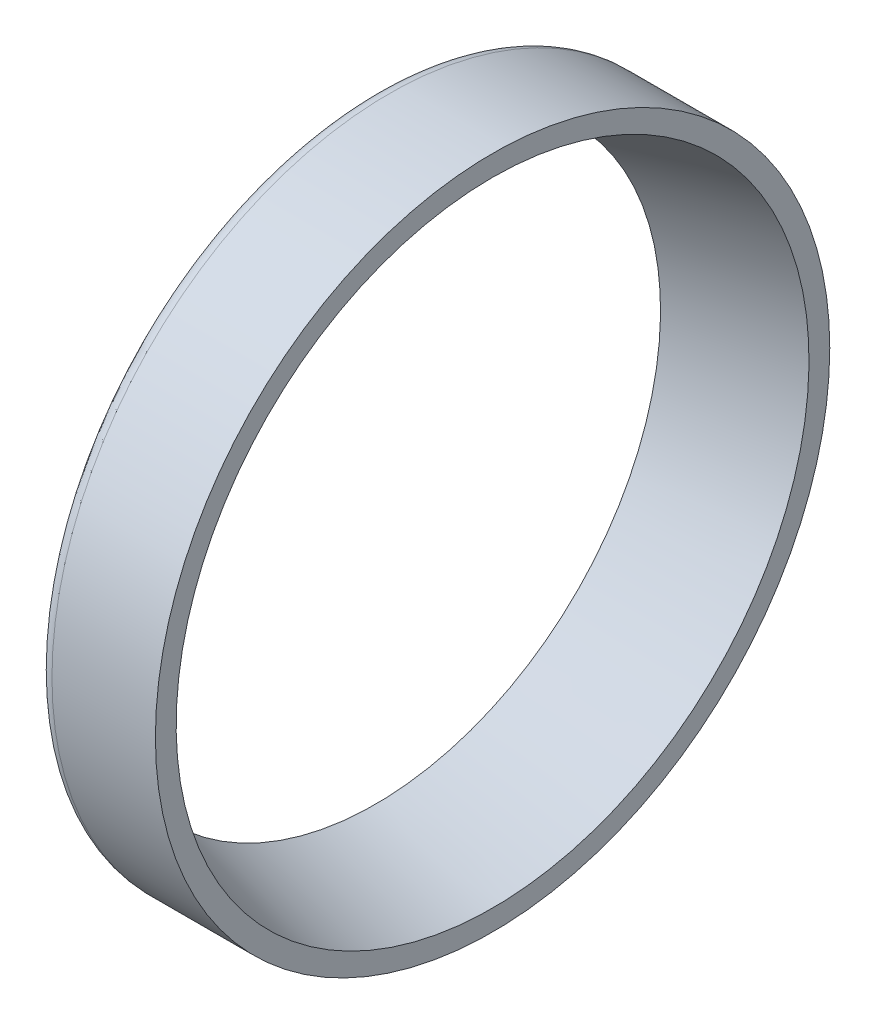
ISO-10303-21;
HEADER;
FILE_DESCRIPTION(('STEP AP214'),'2;1');
FILE_NAME('part.step','',(''),(''),'','','');
FILE_SCHEMA(('AUTOMOTIVE_DESIGN { 1 0 10303 214 1 1 1 1 }'));
ENDSEC;
DATA;
#1=APPLICATION_CONTEXT('core data for automotive mechanical design processes');
#2=APPLICATION_PROTOCOL_DEFINITION('international standard','automotive_design',2000,#1);
#3=PRODUCT_CONTEXT('',#1,'mechanical');
#4=PRODUCT('Part','Part','',(#3));
#5=PRODUCT_RELATED_PRODUCT_CATEGORY('part','',(#4));
#6=PRODUCT_DEFINITION_FORMATION('','',#4);
#7=PRODUCT_DEFINITION_CONTEXT('part definition',#1,'design');
#8=PRODUCT_DEFINITION('design','',#6,#7);
#9=PRODUCT_DEFINITION_SHAPE('','',#8);
#10=(LENGTH_UNIT() NAMED_UNIT(*) SI_UNIT(.MILLI.,.METRE.));
#11=(NAMED_UNIT(*) PLANE_ANGLE_UNIT() SI_UNIT($,.RADIAN.));
#12=(NAMED_UNIT(*) SI_UNIT($,.STERADIAN.) SOLID_ANGLE_UNIT());
#13=UNCERTAINTY_MEASURE_WITH_UNIT(LENGTH_MEASURE(1.E-05),#10,'distance_accuracy_value','');
#14=(GEOMETRIC_REPRESENTATION_CONTEXT(3) GLOBAL_UNCERTAINTY_ASSIGNED_CONTEXT((#13)) GLOBAL_UNIT_ASSIGNED_CONTEXT((#10,
#11,#12)) REPRESENTATION_CONTEXT('',''));
#15=CARTESIAN_POINT('',(0.,0.,0.));
#16=DIRECTION('',(0.,0.,1.));
#17=DIRECTION('',(1.,0.,0.));
#18=AXIS2_PLACEMENT_3D('',#15,#16,#17);
#19=CARTESIAN_POINT('',(50.,0.,0.));
#20=DIRECTION('',(-1.,0.,0.));
#21=DIRECTION('',(0.,0.,1.));
#22=AXIS2_PLACEMENT_3D('',#19,#20,#21);
#23=CYLINDRICAL_SURFACE('',#22,36.5125);
#24=CARTESIAN_POINT('',(12.7,0.,0.));
#25=DIRECTION('',(-1.,0.,0.));
#26=DIRECTION('',(0.,0.,1.));
#27=AXIS2_PLACEMENT_3D('',#24,#25,#26);
#28=CIRCLE('',#27,36.5125);
#29=CARTESIAN_POINT('',(12.7,0.,36.5125));
#30=VERTEX_POINT('',#29);
#31=EDGE_CURVE('E17',#30,#30,#28,.F.);
#32=ORIENTED_EDGE('',*,*,#31,.F.);
#33=EDGE_LOOP('',(#32));
#34=FACE_BOUND('',#33,.T.);
#35=CARTESIAN_POINT('',(1.5,0.,0.));
#36=DIRECTION('',(1.,0.,0.));
#37=DIRECTION('',(0.,0.,-1.));
#38=AXIS2_PLACEMENT_3D('',#35,#36,#37);
#39=CIRCLE('',#38,36.5125);
#40=CARTESIAN_POINT('',(1.5,0.,-36.5125));
#41=VERTEX_POINT('',#40);
#42=EDGE_CURVE('E52',#41,#41,#39,.F.);
#43=ORIENTED_EDGE('',*,*,#42,.F.);
#44=EDGE_LOOP('',(#43));
#45=FACE_BOUND('',#44,.T.);
#46=ADVANCED_FACE('F14',(#34,#45),#23,.T.);
#47=CARTESIAN_POINT('',(1.5,0.,0.));
#48=DIRECTION('',(1.,0.,0.));
#49=DIRECTION('',(0.,0.,-1.));
#50=AXIS2_PLACEMENT_3D('',#47,#48,#49);
#51=TOROIDAL_SURFACE('',#50,35.0125,1.50000000000001);
#52=ORIENTED_EDGE('',*,*,#42,.T.);
#53=EDGE_LOOP('',(#52));
#54=FACE_BOUND('',#53,.T.);
#55=CARTESIAN_POINT('',(0.,0.,0.));
#56=DIRECTION('',(1.,0.,0.));
#57=DIRECTION('',(0.,0.,-1.));
#58=AXIS2_PLACEMENT_3D('',#55,#56,#57);
#59=CIRCLE('',#58,35.0125000223517);
#60=CARTESIAN_POINT('',(0.,0.,-35.0125000223517));
#61=VERTEX_POINT('',#60);
#62=EDGE_CURVE('E26',#61,#61,#59,.F.);
#63=ORIENTED_EDGE('',*,*,#62,.F.);
#64=EDGE_LOOP('',(#63));
#65=FACE_BOUND('',#64,.T.);
#66=ADVANCED_FACE('F33',(#54,#65),#51,.T.);
#67=CARTESIAN_POINT('',(12.7,34.2645100222922,0.));
#68=DIRECTION('',(1.,0.,0.));
#69=DIRECTION('',(0.,0.,-1.));
#70=AXIS2_PLACEMENT_3D('',#67,#68,#69);
#71=PLANE('',#70);
#72=CARTESIAN_POINT('',(12.7,0.,0.));
#73=DIRECTION('',(1.,0.,0.));
#74=DIRECTION('',(0.,1.,0.));
#75=AXIS2_PLACEMENT_3D('',#72,#73,#74);
#76=CIRCLE('',#75,34.2645100222922);
#77=CARTESIAN_POINT('',(12.7,34.2645100222922,0.));
#78=VERTEX_POINT('',#77);
#79=EDGE_CURVE('E21',#78,#78,#76,.F.);
#80=ORIENTED_EDGE('',*,*,#79,.T.);
#81=EDGE_LOOP('',(#80));
#82=FACE_BOUND('',#81,.T.);
#83=ORIENTED_EDGE('',*,*,#31,.T.);
#84=EDGE_LOOP('',(#83));
#85=FACE_BOUND('',#84,.T.);
#86=ADVANCED_FACE('F43',(#82,#85),#71,.T.);
#87=CARTESIAN_POINT('',(0.,35.0125,0.));
#88=DIRECTION('',(-1.,0.,0.));
#89=DIRECTION('',(0.,0.,1.));
#90=AXIS2_PLACEMENT_3D('',#87,#88,#89);
#91=PLANE('',#90);
#92=ORIENTED_EDGE('',*,*,#62,.T.);
#93=EDGE_LOOP('',(#92));
#94=FACE_BOUND('',#93,.T.);
#95=CARTESIAN_POINT('',(0.,0.,0.));
#96=DIRECTION('',(1.,0.,0.));
#97=DIRECTION('',(0.,1.,0.));
#98=AXIS2_PLACEMENT_3D('',#95,#96,#97);
#99=CIRCLE('',#98,30.8880608468145);
#100=CARTESIAN_POINT('',(0.,30.8880608468145,0.));
#101=VERTEX_POINT('',#100);
#102=EDGE_CURVE('E10',#101,#101,#99,.T.);
#103=ORIENTED_EDGE('',*,*,#102,.T.);
#104=EDGE_LOOP('',(#103));
#105=FACE_BOUND('',#104,.T.);
#106=ADVANCED_FACE('F61',(#94,#105),#91,.T.);
#107=CARTESIAN_POINT('',(12.7,0.,0.));
#108=DIRECTION('',(1.,0.,0.));
#109=DIRECTION('',(0.,1.,0.));
#110=AXIS2_PLACEMENT_3D('',#107,#108,#109);
#111=CONICAL_SURFACE('',#110,34.2645100222922,0.259851127119185);
#112=ORIENTED_EDGE('',*,*,#102,.F.);
#113=EDGE_LOOP('',(#112));
#114=FACE_BOUND('',#113,.T.);
#115=ORIENTED_EDGE('',*,*,#79,.F.);
#116=EDGE_LOOP('',(#115));
#117=FACE_BOUND('',#116,.T.);
#118=ADVANCED_FACE('F64',(#114,#117),#111,.F.);
#119=CLOSED_SHELL('',(#46,#66,#86,#106,#118));
#120=MANIFOLD_SOLID_BREP('B1',#119);
#121=ADVANCED_BREP_SHAPE_REPRESENTATION('',(#18,#120),#14);
#122=SHAPE_DEFINITION_REPRESENTATION(#9,#121);
ENDSEC;
END-ISO-10303-21;
